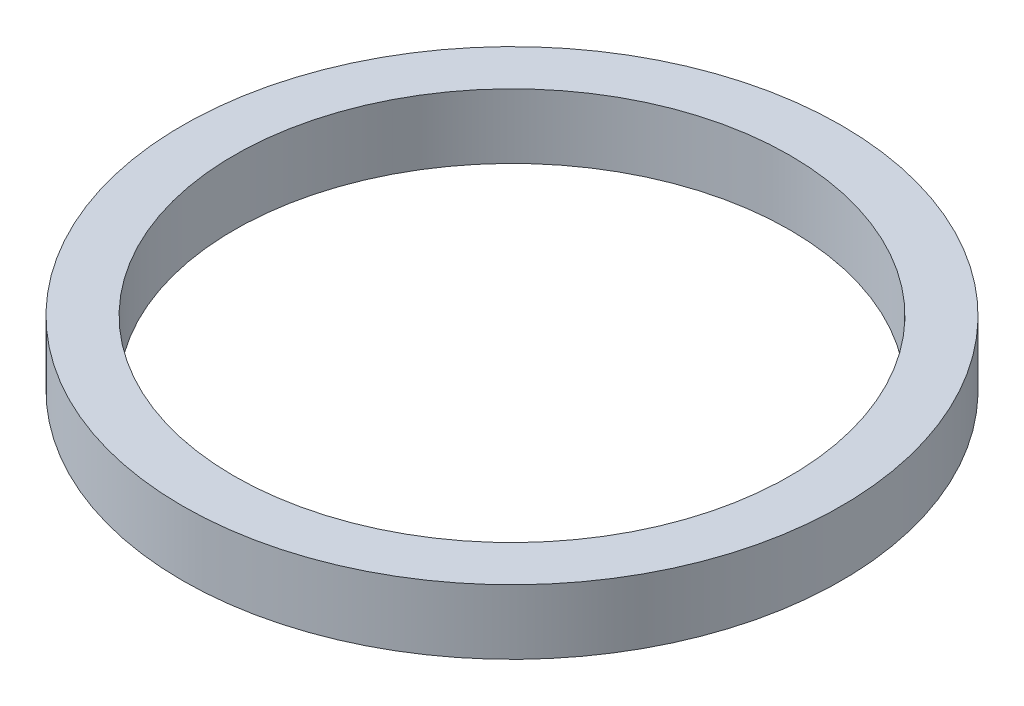
ISO-10303-21;
HEADER;
FILE_DESCRIPTION(('STEP AP214'),'2;1');
FILE_NAME('part.step','',(''),(''),'','','');
FILE_SCHEMA(('AUTOMOTIVE_DESIGN { 1 0 10303 214 1 1 1 1 }'));
ENDSEC;
DATA;
#1=APPLICATION_CONTEXT('core data for automotive mechanical design processes');
#2=APPLICATION_PROTOCOL_DEFINITION('international standard','automotive_design',2000,#1);
#3=PRODUCT_CONTEXT('',#1,'mechanical');
#4=PRODUCT('Part','Part','',(#3));
#5=PRODUCT_RELATED_PRODUCT_CATEGORY('part','',(#4));
#6=PRODUCT_DEFINITION_FORMATION('','',#4);
#7=PRODUCT_DEFINITION_CONTEXT('part definition',#1,'design');
#8=PRODUCT_DEFINITION('design','',#6,#7);
#9=PRODUCT_DEFINITION_SHAPE('','',#8);
#10=(LENGTH_UNIT() NAMED_UNIT(*) SI_UNIT(.MILLI.,.METRE.));
#11=(NAMED_UNIT(*) PLANE_ANGLE_UNIT() SI_UNIT($,.RADIAN.));
#12=(NAMED_UNIT(*) SI_UNIT($,.STERADIAN.) SOLID_ANGLE_UNIT());
#13=UNCERTAINTY_MEASURE_WITH_UNIT(LENGTH_MEASURE(1.E-05),#10,'distance_accuracy_value','');
#14=(GEOMETRIC_REPRESENTATION_CONTEXT(3) GLOBAL_UNCERTAINTY_ASSIGNED_CONTEXT((#13)) GLOBAL_UNIT_ASSIGNED_CONTEXT((#10,
#11,#12)) REPRESENTATION_CONTEXT('',''));
#15=CARTESIAN_POINT('',(0.,0.,0.));
#16=DIRECTION('',(0.,0.,1.));
#17=DIRECTION('',(1.,0.,0.));
#18=AXIS2_PLACEMENT_3D('',#15,#16,#17);
#19=CARTESIAN_POINT('',(0.,5.,0.));
#20=DIRECTION('',(0.,1.,0.));
#21=DIRECTION('',(0.,0.,1.));
#22=AXIS2_PLACEMENT_3D('',#19,#20,#21);
#23=PLANE('',#22);
#24=CARTESIAN_POINT('',(0.,5.,0.));
#25=DIRECTION('',(0.,1.,0.));
#26=DIRECTION('',(0.,0.,1.));
#27=AXIS2_PLACEMENT_3D('',#24,#25,#26);
#28=CIRCLE('',#27,25.5);
#29=CARTESIAN_POINT('',(0.,5.,25.5));
#30=VERTEX_POINT('',#29);
#31=EDGE_CURVE('E10',#30,#30,#28,.T.);
#32=ORIENTED_EDGE('',*,*,#31,.T.);
#33=EDGE_LOOP('',(#32));
#34=FACE_BOUND('',#33,.T.);
#35=CARTESIAN_POINT('',(0.,5.,0.));
#36=DIRECTION('',(0.,1.,0.));
#37=DIRECTION('',(0.,0.,1.));
#38=AXIS2_PLACEMENT_3D('',#35,#36,#37);
#39=CIRCLE('',#38,21.5);
#40=CARTESIAN_POINT('',(0.,5.,21.5));
#41=VERTEX_POINT('',#40);
#42=EDGE_CURVE('E41',#41,#41,#39,.T.);
#43=ORIENTED_EDGE('',*,*,#42,.F.);
#44=EDGE_LOOP('',(#43));
#45=FACE_BOUND('',#44,.T.);
#46=ADVANCED_FACE('F30',(#34,#45),#23,.T.);
#47=CARTESIAN_POINT('',(0.,0.,0.));
#48=DIRECTION('',(0.,1.,0.));
#49=DIRECTION('',(0.,0.,1.));
#50=AXIS2_PLACEMENT_3D('',#47,#48,#49);
#51=PLANE('',#50);
#52=CARTESIAN_POINT('',(0.,0.,0.));
#53=DIRECTION('',(0.,1.,0.));
#54=DIRECTION('',(0.,0.,1.));
#55=AXIS2_PLACEMENT_3D('',#52,#53,#54);
#56=CIRCLE('',#55,25.5);
#57=CARTESIAN_POINT('',(0.,0.,25.5));
#58=VERTEX_POINT('',#57);
#59=EDGE_CURVE('E34',#58,#58,#56,.T.);
#60=ORIENTED_EDGE('',*,*,#59,.F.);
#61=EDGE_LOOP('',(#60));
#62=FACE_BOUND('',#61,.T.);
#63=CARTESIAN_POINT('',(0.,0.,0.));
#64=DIRECTION('',(0.,1.,0.));
#65=DIRECTION('',(0.,0.,1.));
#66=AXIS2_PLACEMENT_3D('',#63,#64,#65);
#67=CIRCLE('',#66,21.5);
#68=CARTESIAN_POINT('',(0.,0.,21.5));
#69=VERTEX_POINT('',#68);
#70=EDGE_CURVE('E43',#69,#69,#67,.T.);
#71=ORIENTED_EDGE('',*,*,#70,.T.);
#72=EDGE_LOOP('',(#71));
#73=FACE_BOUND('',#72,.T.);
#74=ADVANCED_FACE('F53',(#62,#73),#51,.F.);
#75=CARTESIAN_POINT('',(0.,5.,0.));
#76=DIRECTION('',(0.,-1.,0.));
#77=DIRECTION('',(0.,0.,-1.));
#78=AXIS2_PLACEMENT_3D('',#75,#76,#77);
#79=CYLINDRICAL_SURFACE('',#78,25.5);
#80=ORIENTED_EDGE('',*,*,#31,.F.);
#81=EDGE_LOOP('',(#80));
#82=FACE_BOUND('',#81,.T.);
#83=ORIENTED_EDGE('',*,*,#59,.T.);
#84=EDGE_LOOP('',(#83));
#85=FACE_BOUND('',#84,.T.);
#86=ADVANCED_FACE('F32',(#82,#85),#79,.T.);
#87=CARTESIAN_POINT('',(0.,5.,0.));
#88=DIRECTION('',(0.,-1.,0.));
#89=DIRECTION('',(0.,0.,-1.));
#90=AXIS2_PLACEMENT_3D('',#87,#88,#89);
#91=CYLINDRICAL_SURFACE('',#90,21.5);
#92=ORIENTED_EDGE('',*,*,#42,.T.);
#93=EDGE_LOOP('',(#92));
#94=FACE_BOUND('',#93,.T.);
#95=ORIENTED_EDGE('',*,*,#70,.F.);
#96=EDGE_LOOP('',(#95));
#97=FACE_BOUND('',#96,.T.);
#98=ADVANCED_FACE('F49',(#94,#97),#91,.F.);
#99=CLOSED_SHELL('',(#46,#74,#86,#98));
#100=MANIFOLD_SOLID_BREP('B2',#99);
#101=ADVANCED_BREP_SHAPE_REPRESENTATION('',(#18,#100),#14);
#102=SHAPE_DEFINITION_REPRESENTATION(#9,#101);
ENDSEC;
END-ISO-10303-21;
